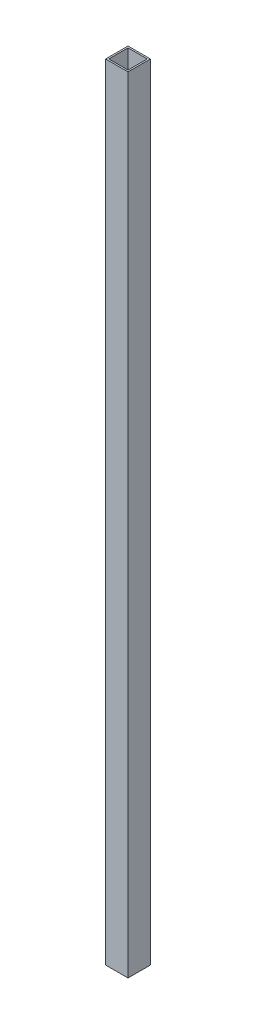
ISO-10303-21;
HEADER;
FILE_DESCRIPTION(('STEP AP214'),'2;1');
FILE_NAME('part.step','',(''),(''),'','','');
FILE_SCHEMA(('AUTOMOTIVE_DESIGN { 1 0 10303 214 1 1 1 1 }'));
ENDSEC;
DATA;
#1=APPLICATION_CONTEXT('core data for automotive mechanical design processes');
#2=APPLICATION_PROTOCOL_DEFINITION('international standard','automotive_design',2000,#1);
#3=PRODUCT_CONTEXT('',#1,'mechanical');
#4=PRODUCT('Part','Part','',(#3));
#5=PRODUCT_RELATED_PRODUCT_CATEGORY('part','',(#4));
#6=PRODUCT_DEFINITION_FORMATION('','',#4);
#7=PRODUCT_DEFINITION_CONTEXT('part definition',#1,'design');
#8=PRODUCT_DEFINITION('design','',#6,#7);
#9=PRODUCT_DEFINITION_SHAPE('','',#8);
#10=(LENGTH_UNIT() NAMED_UNIT(*) SI_UNIT(.MILLI.,.METRE.));
#11=(NAMED_UNIT(*) PLANE_ANGLE_UNIT() SI_UNIT($,.RADIAN.));
#12=(NAMED_UNIT(*) SI_UNIT($,.STERADIAN.) SOLID_ANGLE_UNIT());
#13=UNCERTAINTY_MEASURE_WITH_UNIT(LENGTH_MEASURE(1.E-05),#10,'distance_accuracy_value','');
#14=(GEOMETRIC_REPRESENTATION_CONTEXT(3) GLOBAL_UNCERTAINTY_ASSIGNED_CONTEXT((#13)) GLOBAL_UNIT_ASSIGNED_CONTEXT((#10,
#11,#12)) REPRESENTATION_CONTEXT('',''));
#15=CARTESIAN_POINT('',(0.,0.,0.));
#16=DIRECTION('',(0.,0.,1.));
#17=DIRECTION('',(1.,0.,0.));
#18=AXIS2_PLACEMENT_3D('',#15,#16,#17);
#19=CARTESIAN_POINT('',(0.,595.,0.));
#20=DIRECTION('',(0.,1.,0.));
#21=DIRECTION('',(0.,0.,1.));
#22=AXIS2_PLACEMENT_3D('',#19,#20,#21);
#23=PLANE('',#22);
#24=DIRECTION('',(0.,0.,1.));
#25=VECTOR('',#24,1.);
#26=CARTESIAN_POINT('',(-8.5,595.,-8.5));
#27=LINE('',#26,#25);
#28=CARTESIAN_POINT('',(-8.5,595.,-8.5));
#29=VERTEX_POINT('',#28);
#30=CARTESIAN_POINT('',(-8.5,595.,8.5));
#31=VERTEX_POINT('',#30);
#32=EDGE_CURVE('E176',#29,#31,#27,.T.);
#33=ORIENTED_EDGE('',*,*,#32,.T.);
#34=DIRECTION('',(1.,0.,0.));
#35=VECTOR('',#34,1.);
#36=CARTESIAN_POINT('',(-8.5,595.,8.5));
#37=LINE('',#36,#35);
#38=CARTESIAN_POINT('',(8.5,595.,8.5));
#39=VERTEX_POINT('',#38);
#40=EDGE_CURVE('E180',#31,#39,#37,.T.);
#41=ORIENTED_EDGE('',*,*,#40,.T.);
#42=DIRECTION('',(0.,0.,1.));
#43=VECTOR('',#42,1.);
#44=CARTESIAN_POINT('',(8.5,595.,-8.5));
#45=LINE('',#44,#43);
#46=CARTESIAN_POINT('',(8.5,595.,-8.5));
#47=VERTEX_POINT('',#46);
#48=EDGE_CURVE('E184',#47,#39,#45,.T.);
#49=ORIENTED_EDGE('',*,*,#48,.F.);
#50=DIRECTION('',(1.,0.,0.));
#51=VECTOR('',#50,1.);
#52=CARTESIAN_POINT('',(-8.5,595.,-8.5));
#53=LINE('',#52,#51);
#54=EDGE_CURVE('E188',#29,#47,#53,.T.);
#55=ORIENTED_EDGE('',*,*,#54,.F.);
#56=EDGE_LOOP('',(#33,#41,#49,#55));
#57=FACE_BOUND('',#56,.T.);
#58=DIRECTION('',(1.,0.,0.));
#59=VECTOR('',#58,1.);
#60=CARTESIAN_POINT('',(-7.3,595.,7.3));
#61=LINE('',#60,#59);
#62=CARTESIAN_POINT('',(-7.3,595.,7.3));
#63=VERTEX_POINT('',#62);
#64=CARTESIAN_POINT('',(7.3,595.,7.3));
#65=VERTEX_POINT('',#64);
#66=EDGE_CURVE('E139',#63,#65,#61,.T.);
#67=ORIENTED_EDGE('',*,*,#66,.F.);
#68=DIRECTION('',(0.,0.,1.));
#69=VECTOR('',#68,1.);
#70=CARTESIAN_POINT('',(-7.3,595.,-7.3));
#71=LINE('',#70,#69);
#72=CARTESIAN_POINT('',(-7.3,595.,-7.3));
#73=VERTEX_POINT('',#72);
#74=EDGE_CURVE('E129',#73,#63,#71,.T.);
#75=ORIENTED_EDGE('',*,*,#74,.F.);
#76=DIRECTION('',(1.,0.,0.));
#77=VECTOR('',#76,1.);
#78=CARTESIAN_POINT('',(-7.3,595.,-7.3));
#79=LINE('',#78,#77);
#80=CARTESIAN_POINT('',(7.3,595.,-7.3));
#81=VERTEX_POINT('',#80);
#82=EDGE_CURVE('E153',#73,#81,#79,.T.);
#83=ORIENTED_EDGE('',*,*,#82,.T.);
#84=DIRECTION('',(0.,0.,1.));
#85=VECTOR('',#84,1.);
#86=CARTESIAN_POINT('',(7.3,595.,-7.3));
#87=LINE('',#86,#85);
#88=EDGE_CURVE('E79',#81,#65,#87,.T.);
#89=ORIENTED_EDGE('',*,*,#88,.T.);
#90=EDGE_LOOP('',(#67,#75,#83,#89));
#91=FACE_BOUND('',#90,.T.);
#92=ADVANCED_FACE('F63',(#57,#91),#23,.T.);
#93=CARTESIAN_POINT('',(0.,0.,0.));
#94=DIRECTION('',(0.,1.,0.));
#95=DIRECTION('',(0.,0.,1.));
#96=AXIS2_PLACEMENT_3D('',#93,#94,#95);
#97=PLANE('',#96);
#98=DIRECTION('',(0.,0.,1.));
#99=VECTOR('',#98,1.);
#100=CARTESIAN_POINT('',(-8.5,0.,-8.5));
#101=LINE('',#100,#99);
#102=CARTESIAN_POINT('',(-8.5,0.,-8.5));
#103=VERTEX_POINT('',#102);
#104=CARTESIAN_POINT('',(-8.5,0.,8.5));
#105=VERTEX_POINT('',#104);
#106=EDGE_CURVE('E147',#103,#105,#101,.T.);
#107=ORIENTED_EDGE('',*,*,#106,.F.);
#108=DIRECTION('',(1.,0.,0.));
#109=VECTOR('',#108,1.);
#110=CARTESIAN_POINT('',(-8.5,0.,-8.5));
#111=LINE('',#110,#109);
#112=CARTESIAN_POINT('',(8.5,0.,-8.5));
#113=VERTEX_POINT('',#112);
#114=EDGE_CURVE('E181',#103,#113,#111,.T.);
#115=ORIENTED_EDGE('',*,*,#114,.T.);
#116=DIRECTION('',(0.,0.,1.));
#117=VECTOR('',#116,1.);
#118=CARTESIAN_POINT('',(8.5,0.,-8.5));
#119=LINE('',#118,#117);
#120=CARTESIAN_POINT('',(8.5,0.,8.5));
#121=VERTEX_POINT('',#120);
#122=EDGE_CURVE('E200',#113,#121,#119,.T.);
#123=ORIENTED_EDGE('',*,*,#122,.T.);
#124=DIRECTION('',(1.,0.,0.));
#125=VECTOR('',#124,1.);
#126=CARTESIAN_POINT('',(-8.5,0.,8.5));
#127=LINE('',#126,#125);
#128=EDGE_CURVE('E196',#105,#121,#127,.T.);
#129=ORIENTED_EDGE('',*,*,#128,.F.);
#130=EDGE_LOOP('',(#107,#115,#123,#129));
#131=FACE_BOUND('',#130,.T.);
#132=DIRECTION('',(0.,0.,1.));
#133=VECTOR('',#132,1.);
#134=CARTESIAN_POINT('',(-7.3,0.,-7.3));
#135=LINE('',#134,#133);
#136=CARTESIAN_POINT('',(-7.3,0.,-7.3));
#137=VERTEX_POINT('',#136);
#138=CARTESIAN_POINT('',(-7.3,0.,7.3));
#139=VERTEX_POINT('',#138);
#140=EDGE_CURVE('E87',#137,#139,#135,.T.);
#141=ORIENTED_EDGE('',*,*,#140,.T.);
#142=DIRECTION('',(1.,0.,0.));
#143=VECTOR('',#142,1.);
#144=CARTESIAN_POINT('',(-7.3,0.,7.3));
#145=LINE('',#144,#143);
#146=CARTESIAN_POINT('',(7.3,0.,7.3));
#147=VERTEX_POINT('',#146);
#148=EDGE_CURVE('E145',#139,#147,#145,.T.);
#149=ORIENTED_EDGE('',*,*,#148,.T.);
#150=DIRECTION('',(0.,0.,1.));
#151=VECTOR('',#150,1.);
#152=CARTESIAN_POINT('',(7.3,0.,-7.3));
#153=LINE('',#152,#151);
#154=CARTESIAN_POINT('',(7.3,0.,-7.3));
#155=VERTEX_POINT('',#154);
#156=EDGE_CURVE('E162',#155,#147,#153,.T.);
#157=ORIENTED_EDGE('',*,*,#156,.F.);
#158=DIRECTION('',(1.,0.,0.));
#159=VECTOR('',#158,1.);
#160=CARTESIAN_POINT('',(-7.3,0.,-7.3));
#161=LINE('',#160,#159);
#162=EDGE_CURVE('E140',#137,#155,#161,.T.);
#163=ORIENTED_EDGE('',*,*,#162,.F.);
#164=EDGE_LOOP('',(#141,#149,#157,#163));
#165=FACE_BOUND('',#164,.T.);
#166=ADVANCED_FACE('F222',(#131,#165),#97,.F.);
#167=CARTESIAN_POINT('',(-8.5,595.,-8.5));
#168=DIRECTION('',(1.,0.,0.));
#169=DIRECTION('',(0.,0.,-1.));
#170=AXIS2_PLACEMENT_3D('',#167,#168,#169);
#171=PLANE('',#170);
#172=ORIENTED_EDGE('',*,*,#106,.T.);
#173=DIRECTION('',(0.,-1.,0.));
#174=VECTOR('',#173,1.);
#175=CARTESIAN_POINT('',(-8.5,595.,8.5));
#176=LINE('',#175,#174);
#177=EDGE_CURVE('E12',#31,#105,#176,.T.);
#178=ORIENTED_EDGE('',*,*,#177,.F.);
#179=ORIENTED_EDGE('',*,*,#32,.F.);
#180=DIRECTION('',(0.,-1.,0.));
#181=VECTOR('',#180,1.);
#182=CARTESIAN_POINT('',(-8.5,595.,-8.5));
#183=LINE('',#182,#181);
#184=EDGE_CURVE('E192',#29,#103,#183,.T.);
#185=ORIENTED_EDGE('',*,*,#184,.T.);
#186=EDGE_LOOP('',(#172,#178,#179,#185));
#187=FACE_BOUND('',#186,.T.);
#188=ADVANCED_FACE('F65',(#187),#171,.F.);
#189=CARTESIAN_POINT('',(-8.5,595.,8.5));
#190=DIRECTION('',(0.,0.,-1.));
#191=DIRECTION('',(-1.,0.,0.));
#192=AXIS2_PLACEMENT_3D('',#189,#190,#191);
#193=PLANE('',#192);
#194=ORIENTED_EDGE('',*,*,#128,.T.);
#195=DIRECTION('',(0.,-1.,0.));
#196=VECTOR('',#195,1.);
#197=CARTESIAN_POINT('',(8.5,595.,8.5));
#198=LINE('',#197,#196);
#199=EDGE_CURVE('E72',#39,#121,#198,.T.);
#200=ORIENTED_EDGE('',*,*,#199,.F.);
#201=ORIENTED_EDGE('',*,*,#40,.F.);
#202=ORIENTED_EDGE('',*,*,#177,.T.);
#203=EDGE_LOOP('',(#194,#200,#201,#202));
#204=FACE_BOUND('',#203,.T.);
#205=ADVANCED_FACE('F218',(#204),#193,.F.);
#206=CARTESIAN_POINT('',(8.5,595.,-8.5));
#207=DIRECTION('',(1.,0.,0.));
#208=DIRECTION('',(0.,0.,-1.));
#209=AXIS2_PLACEMENT_3D('',#206,#207,#208);
#210=PLANE('',#209);
#211=ORIENTED_EDGE('',*,*,#122,.F.);
#212=DIRECTION('',(0.,-1.,0.));
#213=VECTOR('',#212,1.);
#214=CARTESIAN_POINT('',(8.5,595.,-8.5));
#215=LINE('',#214,#213);
#216=EDGE_CURVE('E209',#47,#113,#215,.T.);
#217=ORIENTED_EDGE('',*,*,#216,.F.);
#218=ORIENTED_EDGE('',*,*,#48,.T.);
#219=ORIENTED_EDGE('',*,*,#199,.T.);
#220=EDGE_LOOP('',(#211,#217,#218,#219));
#221=FACE_BOUND('',#220,.T.);
#222=ADVANCED_FACE('F215',(#221),#210,.T.);
#223=CARTESIAN_POINT('',(-8.5,595.,-8.5));
#224=DIRECTION('',(0.,0.,-1.));
#225=DIRECTION('',(-1.,0.,0.));
#226=AXIS2_PLACEMENT_3D('',#223,#224,#225);
#227=PLANE('',#226);
#228=ORIENTED_EDGE('',*,*,#114,.F.);
#229=ORIENTED_EDGE('',*,*,#184,.F.);
#230=ORIENTED_EDGE('',*,*,#54,.T.);
#231=ORIENTED_EDGE('',*,*,#216,.T.);
#232=EDGE_LOOP('',(#228,#229,#230,#231));
#233=FACE_BOUND('',#232,.T.);
#234=ADVANCED_FACE('F226',(#233),#227,.T.);
#235=CARTESIAN_POINT('',(-7.3,595.,-7.3));
#236=DIRECTION('',(1.,0.,0.));
#237=DIRECTION('',(0.,0.,-1.));
#238=AXIS2_PLACEMENT_3D('',#235,#236,#237);
#239=PLANE('',#238);
#240=ORIENTED_EDGE('',*,*,#140,.F.);
#241=DIRECTION('',(0.,-1.,0.));
#242=VECTOR('',#241,1.);
#243=CARTESIAN_POINT('',(-7.3,595.,-7.3));
#244=LINE('',#243,#242);
#245=EDGE_CURVE('E133',#73,#137,#244,.T.);
#246=ORIENTED_EDGE('',*,*,#245,.F.);
#247=ORIENTED_EDGE('',*,*,#74,.T.);
#248=DIRECTION('',(0.,-1.,0.));
#249=VECTOR('',#248,1.);
#250=CARTESIAN_POINT('',(-7.3,595.,7.3));
#251=LINE('',#250,#249);
#252=EDGE_CURVE('E132',#63,#139,#251,.T.);
#253=ORIENTED_EDGE('',*,*,#252,.T.);
#254=EDGE_LOOP('',(#240,#246,#247,#253));
#255=FACE_BOUND('',#254,.T.);
#256=ADVANCED_FACE('F131',(#255),#239,.T.);
#257=CARTESIAN_POINT('',(-7.3,595.,7.3));
#258=DIRECTION('',(0.,0.,-1.));
#259=DIRECTION('',(-1.,0.,0.));
#260=AXIS2_PLACEMENT_3D('',#257,#258,#259);
#261=PLANE('',#260);
#262=ORIENTED_EDGE('',*,*,#148,.F.);
#263=ORIENTED_EDGE('',*,*,#252,.F.);
#264=ORIENTED_EDGE('',*,*,#66,.T.);
#265=DIRECTION('',(0.,-1.,0.));
#266=VECTOR('',#265,1.);
#267=CARTESIAN_POINT('',(7.3,595.,7.3));
#268=LINE('',#267,#266);
#269=EDGE_CURVE('E148',#65,#147,#268,.T.);
#270=ORIENTED_EDGE('',*,*,#269,.T.);
#271=EDGE_LOOP('',(#262,#263,#264,#270));
#272=FACE_BOUND('',#271,.T.);
#273=ADVANCED_FACE('F143',(#272),#261,.T.);
#274=CARTESIAN_POINT('',(7.3,595.,-7.3));
#275=DIRECTION('',(1.,0.,0.));
#276=DIRECTION('',(0.,0.,-1.));
#277=AXIS2_PLACEMENT_3D('',#274,#275,#276);
#278=PLANE('',#277);
#279=ORIENTED_EDGE('',*,*,#156,.T.);
#280=ORIENTED_EDGE('',*,*,#269,.F.);
#281=ORIENTED_EDGE('',*,*,#88,.F.);
#282=DIRECTION('',(0.,-1.,0.));
#283=VECTOR('',#282,1.);
#284=CARTESIAN_POINT('',(7.3,595.,-7.3));
#285=LINE('',#284,#283);
#286=EDGE_CURVE('E171',#81,#155,#285,.T.);
#287=ORIENTED_EDGE('',*,*,#286,.T.);
#288=EDGE_LOOP('',(#279,#280,#281,#287));
#289=FACE_BOUND('',#288,.T.);
#290=ADVANCED_FACE('F266',(#289),#278,.F.);
#291=CARTESIAN_POINT('',(-7.3,595.,-7.3));
#292=DIRECTION('',(0.,0.,-1.));
#293=DIRECTION('',(-1.,0.,0.));
#294=AXIS2_PLACEMENT_3D('',#291,#292,#293);
#295=PLANE('',#294);
#296=ORIENTED_EDGE('',*,*,#162,.T.);
#297=ORIENTED_EDGE('',*,*,#286,.F.);
#298=ORIENTED_EDGE('',*,*,#82,.F.);
#299=ORIENTED_EDGE('',*,*,#245,.T.);
#300=EDGE_LOOP('',(#296,#297,#298,#299));
#301=FACE_BOUND('',#300,.T.);
#302=ADVANCED_FACE('F272',(#301),#295,.F.);
#303=CLOSED_SHELL('',(#92,#166,#188,#205,#222,#234,#256,#273,#290,#302));
#304=MANIFOLD_SOLID_BREP('B2',#303);
#305=ADVANCED_BREP_SHAPE_REPRESENTATION('',(#18,#304),#14);
#306=SHAPE_DEFINITION_REPRESENTATION(#9,#305);
ENDSEC;
END-ISO-10303-21;
